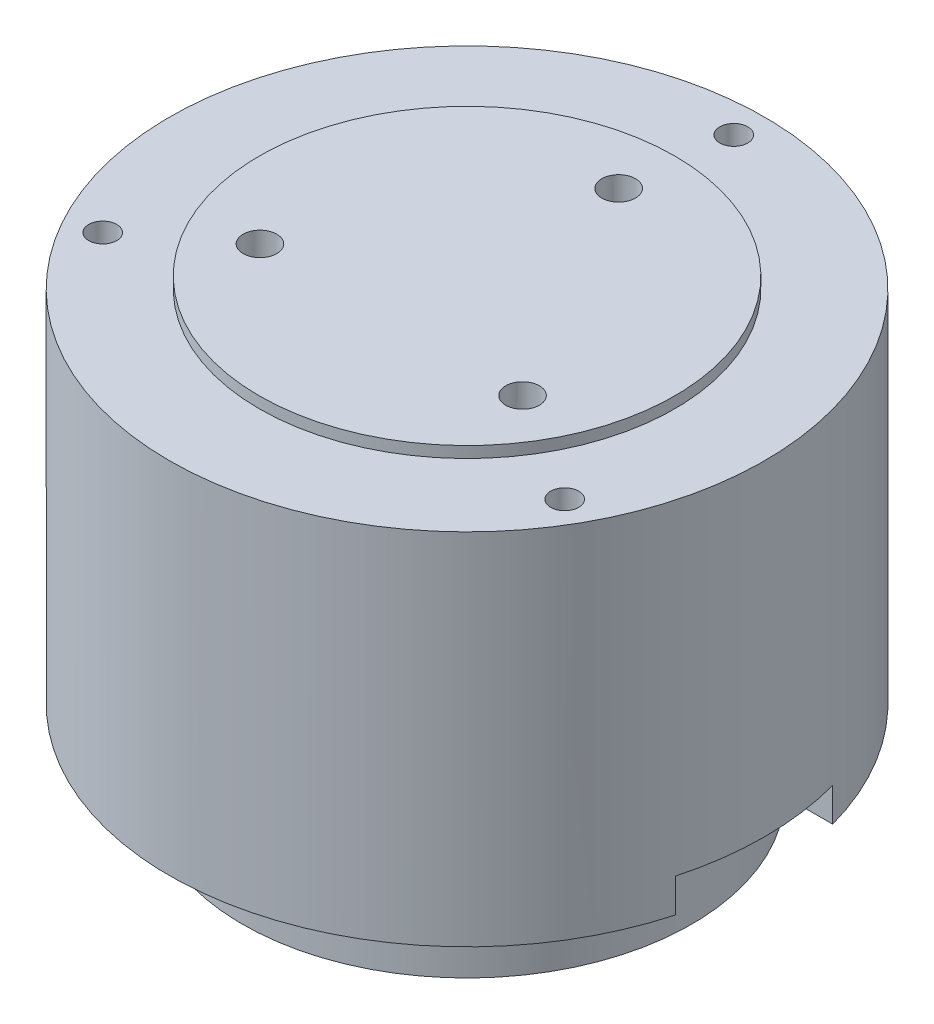
ISO-10303-21;
HEADER;
FILE_DESCRIPTION(('STEP AP214'),'2;1');
FILE_NAME('part.step','',(''),(''),'','','');
FILE_SCHEMA(('AUTOMOTIVE_DESIGN { 1 0 10303 214 1 1 1 1 }'));
ENDSEC;
DATA;
#1=APPLICATION_CONTEXT('core data for automotive mechanical design processes');
#2=APPLICATION_PROTOCOL_DEFINITION('international standard','automotive_design',2000,#1);
#3=PRODUCT_CONTEXT('',#1,'mechanical');
#4=PRODUCT('Part','Part','',(#3));
#5=PRODUCT_RELATED_PRODUCT_CATEGORY('part','',(#4));
#6=PRODUCT_DEFINITION_FORMATION('','',#4);
#7=PRODUCT_DEFINITION_CONTEXT('part definition',#1,'design');
#8=PRODUCT_DEFINITION('design','',#6,#7);
#9=PRODUCT_DEFINITION_SHAPE('','',#8);
#10=(LENGTH_UNIT() NAMED_UNIT(*) SI_UNIT(.MILLI.,.METRE.));
#11=(NAMED_UNIT(*) PLANE_ANGLE_UNIT() SI_UNIT($,.RADIAN.));
#12=(NAMED_UNIT(*) SI_UNIT($,.STERADIAN.) SOLID_ANGLE_UNIT());
#13=UNCERTAINTY_MEASURE_WITH_UNIT(LENGTH_MEASURE(1.E-05),#10,'distance_accuracy_value','');
#14=(GEOMETRIC_REPRESENTATION_CONTEXT(3) GLOBAL_UNCERTAINTY_ASSIGNED_CONTEXT((#13)) GLOBAL_UNIT_ASSIGNED_CONTEXT((#10,
#11,#12)) REPRESENTATION_CONTEXT('',''));
#15=CARTESIAN_POINT('',(0.,0.,0.));
#16=DIRECTION('',(0.,0.,1.));
#17=DIRECTION('',(1.,0.,0.));
#18=AXIS2_PLACEMENT_3D('',#15,#16,#17);
#19=CARTESIAN_POINT('',(0.,0.,0.));
#20=DIRECTION('',(0.,1.,0.));
#21=DIRECTION('',(0.,0.,1.));
#22=AXIS2_PLACEMENT_3D('',#19,#20,#21);
#23=PLANE('',#22);
#24=CARTESIAN_POINT('',(20.5681033398804,0.,11.875));
#25=DIRECTION('',(0.,-1.,0.));
#26=DIRECTION('',(0.,0.,-1.));
#27=AXIS2_PLACEMENT_3D('',#24,#25,#26);
#28=CIRCLE('',#27,1.25);
#29=CARTESIAN_POINT('',(20.5681033398804,0.,10.625));
#30=VERTEX_POINT('',#29);
#31=EDGE_CURVE('E160',#30,#30,#28,.T.);
#32=ORIENTED_EDGE('',*,*,#31,.F.);
#33=EDGE_LOOP('',(#32));
#34=FACE_BOUND('',#33,.T.);
#35=CARTESIAN_POINT('',(-20.5681033398803,0.,11.8750000000002));
#36=DIRECTION('',(0.,-1.,0.));
#37=DIRECTION('',(0.,0.,-1.));
#38=AXIS2_PLACEMENT_3D('',#35,#36,#37);
#39=CIRCLE('',#38,1.25);
#40=CARTESIAN_POINT('',(-20.5681033398803,0.,10.6250000000002));
#41=VERTEX_POINT('',#40);
#42=EDGE_CURVE('E142',#41,#41,#39,.T.);
#43=ORIENTED_EDGE('',*,*,#42,.F.);
#44=EDGE_LOOP('',(#43));
#45=FACE_BOUND('',#44,.T.);
#46=CARTESIAN_POINT('',(0.,0.,23.75));
#47=DIRECTION('',(0.,-1.,0.));
#48=DIRECTION('',(0.,0.,-1.));
#49=AXIS2_PLACEMENT_3D('',#46,#47,#48);
#50=CIRCLE('',#49,1.25);
#51=CARTESIAN_POINT('',(0.,0.,22.5));
#52=VERTEX_POINT('',#51);
#53=EDGE_CURVE('E163',#52,#52,#50,.T.);
#54=ORIENTED_EDGE('',*,*,#53,.F.);
#55=EDGE_LOOP('',(#54));
#56=FACE_BOUND('',#55,.T.);
#57=CARTESIAN_POINT('',(0.,0.,0.));
#58=DIRECTION('',(0.,1.,0.));
#59=DIRECTION('',(0.,0.,1.));
#60=AXIS2_PLACEMENT_3D('',#57,#58,#59);
#61=CIRCLE('',#60,26.5);
#62=CARTESIAN_POINT('',(-25.5587558382641,0.,7.));
#63=VERTEX_POINT('',#62);
#64=CARTESIAN_POINT('',(25.5587558382641,0.,7.));
#65=VERTEX_POINT('',#64);
#66=EDGE_CURVE('E120',#63,#65,#61,.T.);
#67=ORIENTED_EDGE('',*,*,#66,.F.);
#68=DIRECTION('',(-1.,0.,0.));
#69=VECTOR('',#68,1.);
#70=CARTESIAN_POINT('',(-28.911013959568,0.,7.));
#71=LINE('',#70,#69);
#72=CARTESIAN_POINT('',(-18.7349939951952,0.,7.));
#73=VERTEX_POINT('',#72);
#74=EDGE_CURVE('E111',#73,#63,#71,.T.);
#75=ORIENTED_EDGE('',*,*,#74,.F.);
#76=CARTESIAN_POINT('',(0.,0.,0.));
#77=DIRECTION('',(0.,-1.,0.));
#78=DIRECTION('',(0.,0.,-1.));
#79=AXIS2_PLACEMENT_3D('',#76,#77,#78);
#80=CIRCLE('',#79,20.);
#81=CARTESIAN_POINT('',(18.7349939951952,0.,7.));
#82=VERTEX_POINT('',#81);
#83=EDGE_CURVE('E129',#82,#73,#80,.T.);
#84=ORIENTED_EDGE('',*,*,#83,.F.);
#85=EDGE_CURVE('E62',#65,#82,#71,.T.);
#86=ORIENTED_EDGE('',*,*,#85,.F.);
#87=EDGE_LOOP('',(#67,#75,#84,#86));
#88=FACE_BOUND('',#87,.T.);
#89=ADVANCED_FACE('F39',(#34,#45,#56,#88),#23,.F.);
#90=CARTESIAN_POINT('',(0.,32.,0.));
#91=DIRECTION('',(0.,-1.,0.));
#92=DIRECTION('',(0.,0.,-1.));
#93=AXIS2_PLACEMENT_3D('',#90,#91,#92);
#94=CYLINDRICAL_SURFACE('',#93,26.5);
#95=ORIENTED_EDGE('',*,*,#66,.T.);
#96=DIRECTION('',(0.,-1.,0.));
#97=VECTOR('',#96,1.);
#98=CARTESIAN_POINT('',(25.5587558382641,32.,7.));
#99=LINE('',#98,#97);
#100=CARTESIAN_POINT('',(25.5587558382641,3.,7.));
#101=VERTEX_POINT('',#100);
#102=EDGE_CURVE('E212',#65,#101,#99,.F.);
#103=ORIENTED_EDGE('',*,*,#102,.T.);
#104=CARTESIAN_POINT('',(0.,3.,0.));
#105=DIRECTION('',(0.,-1.,0.));
#106=DIRECTION('',(0.,0.,-1.));
#107=AXIS2_PLACEMENT_3D('',#104,#105,#106);
#108=CIRCLE('',#107,26.5);
#109=CARTESIAN_POINT('',(25.5587558382641,3.,-7.));
#110=VERTEX_POINT('',#109);
#111=EDGE_CURVE('E11',#110,#101,#108,.T.);
#112=ORIENTED_EDGE('',*,*,#111,.F.);
#113=DIRECTION('',(0.,-1.,0.));
#114=VECTOR('',#113,1.);
#115=CARTESIAN_POINT('',(25.5587558382641,32.,-7.));
#116=LINE('',#115,#114);
#117=CARTESIAN_POINT('',(25.5587558382641,0.,-7.));
#118=VERTEX_POINT('',#117);
#119=EDGE_CURVE('E99',#110,#118,#116,.T.);
#120=ORIENTED_EDGE('',*,*,#119,.T.);
#121=CARTESIAN_POINT('',(-25.5587558382641,0.,-7.));
#122=VERTEX_POINT('',#121);
#123=EDGE_CURVE('E107',#118,#122,#61,.T.);
#124=ORIENTED_EDGE('',*,*,#123,.T.);
#125=DIRECTION('',(0.,-1.,0.));
#126=VECTOR('',#125,1.);
#127=CARTESIAN_POINT('',(-25.5587558382641,32.,-7.));
#128=LINE('',#127,#126);
#129=CARTESIAN_POINT('',(-25.5587558382641,3.,-7.));
#130=VERTEX_POINT('',#129);
#131=EDGE_CURVE('E92',#122,#130,#128,.F.);
#132=ORIENTED_EDGE('',*,*,#131,.T.);
#133=CARTESIAN_POINT('',(-25.5587558382641,3.,7.));
#134=VERTEX_POINT('',#133);
#135=EDGE_CURVE('E43',#134,#130,#108,.T.);
#136=ORIENTED_EDGE('',*,*,#135,.F.);
#137=DIRECTION('',(0.,-1.,0.));
#138=VECTOR('',#137,1.);
#139=CARTESIAN_POINT('',(-25.5587558382641,32.,7.));
#140=LINE('',#139,#138);
#141=EDGE_CURVE('E196',#134,#63,#140,.T.);
#142=ORIENTED_EDGE('',*,*,#141,.T.);
#143=EDGE_LOOP('',(#95,#103,#112,#120,#124,#132,#136,#142));
#144=FACE_BOUND('',#143,.T.);
#145=CARTESIAN_POINT('',(0.,32.,0.));
#146=DIRECTION('',(0.,1.,0.));
#147=DIRECTION('',(0.,0.,1.));
#148=AXIS2_PLACEMENT_3D('',#145,#146,#147);
#149=CIRCLE('',#148,26.5);
#150=CARTESIAN_POINT('',(0.,32.,26.5));
#151=VERTEX_POINT('',#150);
#152=EDGE_CURVE('E119',#151,#151,#149,.T.);
#153=ORIENTED_EDGE('',*,*,#152,.F.);
#154=EDGE_LOOP('',(#153));
#155=FACE_BOUND('',#154,.T.);
#156=ADVANCED_FACE('F41',(#144,#155),#94,.T.);
#157=CARTESIAN_POINT('',(0.,32.,0.));
#158=DIRECTION('',(0.,1.,0.));
#159=DIRECTION('',(0.,0.,1.));
#160=AXIS2_PLACEMENT_3D('',#157,#158,#159);
#161=PLANE('',#160);
#162=CARTESIAN_POINT('',(0.,32.,-23.75));
#163=DIRECTION('',(0.,1.,0.));
#164=DIRECTION('',(0.,0.,1.));
#165=AXIS2_PLACEMENT_3D('',#162,#163,#164);
#166=CIRCLE('',#165,1.25);
#167=CARTESIAN_POINT('',(0.,32.,-22.5));
#168=VERTEX_POINT('',#167);
#169=EDGE_CURVE('E205',#168,#168,#166,.T.);
#170=ORIENTED_EDGE('',*,*,#169,.F.);
#171=EDGE_LOOP('',(#170));
#172=FACE_BOUND('',#171,.T.);
#173=CARTESIAN_POINT('',(20.5681033398804,32.,11.8750000000001));
#174=DIRECTION('',(0.,1.,0.));
#175=DIRECTION('',(0.,0.,1.));
#176=AXIS2_PLACEMENT_3D('',#173,#174,#175);
#177=CIRCLE('',#176,1.25);
#178=CARTESIAN_POINT('',(20.5681033398804,32.,13.1250000000001));
#179=VERTEX_POINT('',#178);
#180=EDGE_CURVE('E202',#179,#179,#177,.T.);
#181=ORIENTED_EDGE('',*,*,#180,.F.);
#182=EDGE_LOOP('',(#181));
#183=FACE_BOUND('',#182,.T.);
#184=CARTESIAN_POINT('',(-20.5681033398805,32.,11.8749999999998));
#185=DIRECTION('',(0.,1.,0.));
#186=DIRECTION('',(0.,0.,1.));
#187=AXIS2_PLACEMENT_3D('',#184,#185,#186);
#188=CIRCLE('',#187,1.25);
#189=CARTESIAN_POINT('',(-20.5681033398805,32.,13.1249999999998));
#190=VERTEX_POINT('',#189);
#191=EDGE_CURVE('E195',#190,#190,#188,.T.);
#192=ORIENTED_EDGE('',*,*,#191,.F.);
#193=EDGE_LOOP('',(#192));
#194=FACE_BOUND('',#193,.T.);
#195=CARTESIAN_POINT('',(0.,32.,0.));
#196=DIRECTION('',(0.,1.,0.));
#197=DIRECTION('',(0.,0.,1.));
#198=AXIS2_PLACEMENT_3D('',#195,#196,#197);
#199=CIRCLE('',#198,18.5);
#200=CARTESIAN_POINT('',(0.,32.,18.5));
#201=VERTEX_POINT('',#200);
#202=EDGE_CURVE('E128',#201,#201,#199,.T.);
#203=ORIENTED_EDGE('',*,*,#202,.F.);
#204=EDGE_LOOP('',(#203));
#205=FACE_BOUND('',#204,.T.);
#206=ORIENTED_EDGE('',*,*,#152,.T.);
#207=EDGE_LOOP('',(#206));
#208=FACE_BOUND('',#207,.T.);
#209=ADVANCED_FACE('F247',(#172,#183,#194,#205,#208),#161,.T.);
#210=CARTESIAN_POINT('',(-20.5681033398805,0.,-11.8749999999998));
#211=DIRECTION('',(0.,-1.,0.));
#212=DIRECTION('',(0.,0.,-1.));
#213=AXIS2_PLACEMENT_3D('',#210,#211,#212);
#214=CIRCLE('',#213,1.25);
#215=CARTESIAN_POINT('',(-20.5681033398805,0.,-13.1249999999998));
#216=VERTEX_POINT('',#215);
#217=EDGE_CURVE('E141',#216,#216,#214,.T.);
#218=ORIENTED_EDGE('',*,*,#217,.F.);
#219=EDGE_LOOP('',(#218));
#220=FACE_BOUND('',#219,.T.);
#221=CARTESIAN_POINT('',(-1.65845363595049E-13,0.,-23.75));
#222=DIRECTION('',(0.,-1.,0.));
#223=DIRECTION('',(0.,0.,-1.));
#224=AXIS2_PLACEMENT_3D('',#221,#222,#223);
#225=CIRCLE('',#224,1.25);
#226=CARTESIAN_POINT('',(-1.65845363595049E-13,0.,-25.));
#227=VERTEX_POINT('',#226);
#228=EDGE_CURVE('E148',#227,#227,#225,.T.);
#229=ORIENTED_EDGE('',*,*,#228,.F.);
#230=EDGE_LOOP('',(#229));
#231=FACE_BOUND('',#230,.T.);
#232=CARTESIAN_POINT('',(20.5681033398804,0.,-11.8750000000001));
#233=DIRECTION('',(0.,-1.,0.));
#234=DIRECTION('',(0.,0.,-1.));
#235=AXIS2_PLACEMENT_3D('',#232,#233,#234);
#236=CIRCLE('',#235,1.25);
#237=CARTESIAN_POINT('',(20.5681033398804,0.,-13.1250000000001));
#238=VERTEX_POINT('',#237);
#239=EDGE_CURVE('E154',#238,#238,#236,.T.);
#240=ORIENTED_EDGE('',*,*,#239,.F.);
#241=EDGE_LOOP('',(#240));
#242=FACE_BOUND('',#241,.T.);
#243=ORIENTED_EDGE('',*,*,#123,.F.);
#244=DIRECTION('',(1.,0.,0.));
#245=VECTOR('',#244,1.);
#246=CARTESIAN_POINT('',(-28.911013959568,0.,-7.));
#247=LINE('',#246,#245);
#248=CARTESIAN_POINT('',(18.7349939951952,0.,-7.));
#249=VERTEX_POINT('',#248);
#250=EDGE_CURVE('E114',#249,#118,#247,.T.);
#251=ORIENTED_EDGE('',*,*,#250,.F.);
#252=CARTESIAN_POINT('',(-18.7349939951952,0.,-7.));
#253=VERTEX_POINT('',#252);
#254=EDGE_CURVE('E109',#253,#249,#80,.T.);
#255=ORIENTED_EDGE('',*,*,#254,.F.);
#256=EDGE_CURVE('E54',#122,#253,#247,.T.);
#257=ORIENTED_EDGE('',*,*,#256,.F.);
#258=EDGE_LOOP('',(#243,#251,#255,#257));
#259=FACE_BOUND('',#258,.T.);
#260=ADVANCED_FACE('F105',(#220,#231,#242,#259),#23,.F.);
#261=CARTESIAN_POINT('',(0.,-7.,0.));
#262=DIRECTION('',(0.,1.,0.));
#263=DIRECTION('',(0.,0.,1.));
#264=AXIS2_PLACEMENT_3D('',#261,#262,#263);
#265=CYLINDRICAL_SURFACE('',#264,20.);
#266=CARTESIAN_POINT('',(0.,-7.,0.));
#267=DIRECTION('',(0.,-1.,0.));
#268=DIRECTION('',(0.,0.,-1.));
#269=AXIS2_PLACEMENT_3D('',#266,#267,#268);
#270=CIRCLE('',#269,20.);
#271=CARTESIAN_POINT('',(0.,-7.,-20.));
#272=VERTEX_POINT('',#271);
#273=EDGE_CURVE('E123',#272,#272,#270,.T.);
#274=ORIENTED_EDGE('',*,*,#273,.F.);
#275=EDGE_LOOP('',(#274));
#276=FACE_BOUND('',#275,.T.);
#277=EDGE_CURVE('E125',#249,#82,#80,.T.);
#278=ORIENTED_EDGE('',*,*,#277,.T.);
#279=ORIENTED_EDGE('',*,*,#83,.T.);
#280=EDGE_CURVE('E231',#73,#253,#80,.T.);
#281=ORIENTED_EDGE('',*,*,#280,.T.);
#282=ORIENTED_EDGE('',*,*,#254,.T.);
#283=EDGE_LOOP('',(#278,#279,#281,#282));
#284=FACE_BOUND('',#283,.T.);
#285=ADVANCED_FACE('F230',(#276,#284),#265,.T.);
#286=CARTESIAN_POINT('',(0.,-7.,0.));
#287=DIRECTION('',(0.,-1.,0.));
#288=DIRECTION('',(0.,0.,-1.));
#289=AXIS2_PLACEMENT_3D('',#286,#287,#288);
#290=PLANE('',#289);
#291=ORIENTED_EDGE('',*,*,#273,.T.);
#292=EDGE_LOOP('',(#291));
#293=FACE_BOUND('',#292,.T.);
#294=ADVANCED_FACE('F256',(#293),#290,.T.);
#295=CARTESIAN_POINT('',(0.,33.,0.));
#296=DIRECTION('',(0.,-1.,0.));
#297=DIRECTION('',(0.,0.,-1.));
#298=AXIS2_PLACEMENT_3D('',#295,#296,#297);
#299=CYLINDRICAL_SURFACE('',#298,18.5);
#300=CARTESIAN_POINT('',(0.,33.,0.));
#301=DIRECTION('',(0.,1.,0.));
#302=DIRECTION('',(0.,0.,1.));
#303=AXIS2_PLACEMENT_3D('',#300,#301,#302);
#304=CIRCLE('',#303,18.5);
#305=CARTESIAN_POINT('',(0.,33.,18.5));
#306=VERTEX_POINT('',#305);
#307=EDGE_CURVE('E132',#306,#306,#304,.T.);
#308=ORIENTED_EDGE('',*,*,#307,.F.);
#309=EDGE_LOOP('',(#308));
#310=FACE_BOUND('',#309,.T.);
#311=ORIENTED_EDGE('',*,*,#202,.T.);
#312=EDGE_LOOP('',(#311));
#313=FACE_BOUND('',#312,.T.);
#314=ADVANCED_FACE('F305',(#310,#313),#299,.T.);
#315=CARTESIAN_POINT('',(0.,33.,0.));
#316=DIRECTION('',(0.,1.,0.));
#317=DIRECTION('',(0.,0.,1.));
#318=AXIS2_PLACEMENT_3D('',#315,#316,#317);
#319=PLANE('',#318);
#320=CARTESIAN_POINT('',(0.,33.,-13.5));
#321=DIRECTION('',(0.,1.,0.));
#322=DIRECTION('',(0.,0.,1.));
#323=AXIS2_PLACEMENT_3D('',#320,#321,#322);
#324=CIRCLE('',#323,1.5);
#325=CARTESIAN_POINT('',(0.,33.,-12.));
#326=VERTEX_POINT('',#325);
#327=EDGE_CURVE('E187',#326,#326,#324,.T.);
#328=ORIENTED_EDGE('',*,*,#327,.F.);
#329=EDGE_LOOP('',(#328));
#330=FACE_BOUND('',#329,.T.);
#331=CARTESIAN_POINT('',(11.6913429510899,33.,6.75000000000005));
#332=DIRECTION('',(0.,1.,0.));
#333=DIRECTION('',(0.,0.,1.));
#334=AXIS2_PLACEMENT_3D('',#331,#332,#333);
#335=CIRCLE('',#334,1.5);
#336=CARTESIAN_POINT('',(11.6913429510899,33.,8.25000000000006));
#337=VERTEX_POINT('',#336);
#338=EDGE_CURVE('E184',#337,#337,#335,.T.);
#339=ORIENTED_EDGE('',*,*,#338,.F.);
#340=EDGE_LOOP('',(#339));
#341=FACE_BOUND('',#340,.T.);
#342=CARTESIAN_POINT('',(-11.69134295109,33.,6.74999999999989));
#343=DIRECTION('',(0.,1.,0.));
#344=DIRECTION('',(0.,0.,1.));
#345=AXIS2_PLACEMENT_3D('',#342,#343,#344);
#346=CIRCLE('',#345,1.5);
#347=CARTESIAN_POINT('',(-11.69134295109,33.,8.24999999999989));
#348=VERTEX_POINT('',#347);
#349=EDGE_CURVE('E177',#348,#348,#346,.T.);
#350=ORIENTED_EDGE('',*,*,#349,.F.);
#351=EDGE_LOOP('',(#350));
#352=FACE_BOUND('',#351,.T.);
#353=ORIENTED_EDGE('',*,*,#307,.T.);
#354=EDGE_LOOP('',(#353));
#355=FACE_BOUND('',#354,.T.);
#356=ADVANCED_FACE('F302',(#330,#341,#352,#355),#319,.T.);
#357=CARTESIAN_POINT('',(20.5681033398804,3.,11.875));
#358=DIRECTION('',(0.,-1.,0.));
#359=DIRECTION('',(0.,0.,-1.));
#360=AXIS2_PLACEMENT_3D('',#357,#358,#359);
#361=CYLINDRICAL_SURFACE('',#360,1.25);
#362=CARTESIAN_POINT('',(20.5681033398804,3.,11.875));
#363=DIRECTION('',(0.,-1.,0.));
#364=DIRECTION('',(0.,0.,-1.));
#365=AXIS2_PLACEMENT_3D('',#362,#363,#364);
#366=CIRCLE('',#365,1.25);
#367=CARTESIAN_POINT('',(20.5681033398804,3.,10.625));
#368=VERTEX_POINT('',#367);
#369=EDGE_CURVE('E157',#368,#368,#366,.T.);
#370=ORIENTED_EDGE('',*,*,#369,.F.);
#371=EDGE_LOOP('',(#370));
#372=FACE_BOUND('',#371,.T.);
#373=ORIENTED_EDGE('',*,*,#31,.T.);
#374=EDGE_LOOP('',(#373));
#375=FACE_BOUND('',#374,.T.);
#376=ADVANCED_FACE('F280',(#372,#375),#361,.F.);
#377=CARTESIAN_POINT('',(20.5681033398804,3.,11.875));
#378=DIRECTION('',(0.,-1.,0.));
#379=DIRECTION('',(0.,0.,-1.));
#380=AXIS2_PLACEMENT_3D('',#377,#378,#379);
#381=PLANE('',#380);
#382=ORIENTED_EDGE('',*,*,#369,.T.);
#383=EDGE_LOOP('',(#382));
#384=FACE_BOUND('',#383,.T.);
#385=ADVANCED_FACE('F270',(#384),#381,.T.);
#386=CARTESIAN_POINT('',(20.5681033398804,3.,-11.8750000000001));
#387=DIRECTION('',(0.,-1.,0.));
#388=DIRECTION('',(0.,0.,-1.));
#389=AXIS2_PLACEMENT_3D('',#386,#387,#388);
#390=CYLINDRICAL_SURFACE('',#389,1.25);
#391=CARTESIAN_POINT('',(20.5681033398804,3.,-11.8750000000001));
#392=DIRECTION('',(0.,-1.,0.));
#393=DIRECTION('',(0.,0.,-1.));
#394=AXIS2_PLACEMENT_3D('',#391,#392,#393);
#395=CIRCLE('',#394,1.25);
#396=CARTESIAN_POINT('',(20.5681033398804,3.,-13.1250000000001));
#397=VERTEX_POINT('',#396);
#398=EDGE_CURVE('E151',#397,#397,#395,.T.);
#399=ORIENTED_EDGE('',*,*,#398,.F.);
#400=EDGE_LOOP('',(#399));
#401=FACE_BOUND('',#400,.T.);
#402=ORIENTED_EDGE('',*,*,#239,.T.);
#403=EDGE_LOOP('',(#402));
#404=FACE_BOUND('',#403,.T.);
#405=ADVANCED_FACE('F267',(#401,#404),#390,.F.);
#406=CARTESIAN_POINT('',(20.5681033398804,3.,-11.8750000000001));
#407=DIRECTION('',(0.,-1.,0.));
#408=DIRECTION('',(0.,0.,-1.));
#409=AXIS2_PLACEMENT_3D('',#406,#407,#408);
#410=PLANE('',#409);
#411=ORIENTED_EDGE('',*,*,#398,.T.);
#412=EDGE_LOOP('',(#411));
#413=FACE_BOUND('',#412,.T.);
#414=ADVANCED_FACE('F269',(#413),#410,.T.);
#415=CARTESIAN_POINT('',(-1.65845363595049E-13,3.,-23.75));
#416=DIRECTION('',(0.,-1.,0.));
#417=DIRECTION('',(0.,0.,-1.));
#418=AXIS2_PLACEMENT_3D('',#415,#416,#417);
#419=CYLINDRICAL_SURFACE('',#418,1.25);
#420=CARTESIAN_POINT('',(-1.65845363595049E-13,3.,-23.75));
#421=DIRECTION('',(0.,-1.,0.));
#422=DIRECTION('',(0.,0.,-1.));
#423=AXIS2_PLACEMENT_3D('',#420,#421,#422);
#424=CIRCLE('',#423,1.25);
#425=CARTESIAN_POINT('',(-1.65845363595049E-13,3.,-25.));
#426=VERTEX_POINT('',#425);
#427=EDGE_CURVE('E145',#426,#426,#424,.T.);
#428=ORIENTED_EDGE('',*,*,#427,.F.);
#429=EDGE_LOOP('',(#428));
#430=FACE_BOUND('',#429,.T.);
#431=ORIENTED_EDGE('',*,*,#228,.T.);
#432=EDGE_LOOP('',(#431));
#433=FACE_BOUND('',#432,.T.);
#434=ADVANCED_FACE('F277',(#430,#433),#419,.F.);
#435=CARTESIAN_POINT('',(-1.65845363595049E-13,3.,-23.75));
#436=DIRECTION('',(0.,-1.,0.));
#437=DIRECTION('',(0.,0.,-1.));
#438=AXIS2_PLACEMENT_3D('',#435,#436,#437);
#439=PLANE('',#438);
#440=ORIENTED_EDGE('',*,*,#427,.T.);
#441=EDGE_LOOP('',(#440));
#442=FACE_BOUND('',#441,.T.);
#443=ADVANCED_FACE('F288',(#442),#439,.T.);
#444=CARTESIAN_POINT('',(-20.5681033398805,3.,-11.8749999999998));
#445=DIRECTION('',(0.,-1.,0.));
#446=DIRECTION('',(0.,0.,-1.));
#447=AXIS2_PLACEMENT_3D('',#444,#445,#446);
#448=CYLINDRICAL_SURFACE('',#447,1.25);
#449=CARTESIAN_POINT('',(-20.5681033398805,3.,-11.8749999999998));
#450=DIRECTION('',(0.,-1.,0.));
#451=DIRECTION('',(0.,0.,-1.));
#452=AXIS2_PLACEMENT_3D('',#449,#450,#451);
#453=CIRCLE('',#452,1.25);
#454=CARTESIAN_POINT('',(-20.5681033398805,3.,-13.1249999999998));
#455=VERTEX_POINT('',#454);
#456=EDGE_CURVE('E138',#455,#455,#453,.T.);
#457=ORIENTED_EDGE('',*,*,#456,.F.);
#458=EDGE_LOOP('',(#457));
#459=FACE_BOUND('',#458,.T.);
#460=ORIENTED_EDGE('',*,*,#217,.T.);
#461=EDGE_LOOP('',(#460));
#462=FACE_BOUND('',#461,.T.);
#463=ADVANCED_FACE('F292',(#459,#462),#448,.F.);
#464=CARTESIAN_POINT('',(-20.5681033398805,3.,-11.8749999999998));
#465=DIRECTION('',(0.,-1.,0.));
#466=DIRECTION('',(0.,0.,-1.));
#467=AXIS2_PLACEMENT_3D('',#464,#465,#466);
#468=PLANE('',#467);
#469=ORIENTED_EDGE('',*,*,#456,.T.);
#470=EDGE_LOOP('',(#469));
#471=FACE_BOUND('',#470,.T.);
#472=ADVANCED_FACE('F296',(#471),#468,.T.);
#473=CARTESIAN_POINT('',(-20.5681033398803,3.,11.8750000000002));
#474=DIRECTION('',(0.,-1.,0.));
#475=DIRECTION('',(0.,0.,-1.));
#476=AXIS2_PLACEMENT_3D('',#473,#474,#475);
#477=CYLINDRICAL_SURFACE('',#476,1.25);
#478=CARTESIAN_POINT('',(-20.5681033398803,3.,11.8750000000002));
#479=DIRECTION('',(0.,-1.,0.));
#480=DIRECTION('',(0.,0.,-1.));
#481=AXIS2_PLACEMENT_3D('',#478,#479,#480);
#482=CIRCLE('',#481,1.25);
#483=CARTESIAN_POINT('',(-20.5681033398803,3.,10.6250000000002));
#484=VERTEX_POINT('',#483);
#485=EDGE_CURVE('E164',#484,#484,#482,.T.);
#486=ORIENTED_EDGE('',*,*,#485,.F.);
#487=EDGE_LOOP('',(#486));
#488=FACE_BOUND('',#487,.T.);
#489=ORIENTED_EDGE('',*,*,#42,.T.);
#490=EDGE_LOOP('',(#489));
#491=FACE_BOUND('',#490,.T.);
#492=ADVANCED_FACE('F300',(#488,#491),#477,.F.);
#493=CARTESIAN_POINT('',(-20.5681033398803,3.,11.8750000000002));
#494=DIRECTION('',(0.,-1.,0.));
#495=DIRECTION('',(0.,0.,-1.));
#496=AXIS2_PLACEMENT_3D('',#493,#494,#495);
#497=PLANE('',#496);
#498=ORIENTED_EDGE('',*,*,#485,.T.);
#499=EDGE_LOOP('',(#498));
#500=FACE_BOUND('',#499,.T.);
#501=ADVANCED_FACE('F378',(#500),#497,.T.);
#502=CARTESIAN_POINT('',(0.,3.,23.75));
#503=DIRECTION('',(0.,-1.,0.));
#504=DIRECTION('',(0.,0.,-1.));
#505=AXIS2_PLACEMENT_3D('',#502,#503,#504);
#506=CYLINDRICAL_SURFACE('',#505,1.25);
#507=CARTESIAN_POINT('',(0.,3.,23.75));
#508=DIRECTION('',(0.,-1.,0.));
#509=DIRECTION('',(0.,0.,-1.));
#510=AXIS2_PLACEMENT_3D('',#507,#508,#509);
#511=CIRCLE('',#510,1.25);
#512=CARTESIAN_POINT('',(0.,3.,22.5));
#513=VERTEX_POINT('',#512);
#514=EDGE_CURVE('E137',#513,#513,#511,.T.);
#515=ORIENTED_EDGE('',*,*,#514,.F.);
#516=EDGE_LOOP('',(#515));
#517=FACE_BOUND('',#516,.T.);
#518=ORIENTED_EDGE('',*,*,#53,.T.);
#519=EDGE_LOOP('',(#518));
#520=FACE_BOUND('',#519,.T.);
#521=ADVANCED_FACE('F388',(#517,#520),#506,.F.);
#522=CARTESIAN_POINT('',(0.,3.,23.75));
#523=DIRECTION('',(0.,-1.,0.));
#524=DIRECTION('',(0.,0.,-1.));
#525=AXIS2_PLACEMENT_3D('',#522,#523,#524);
#526=PLANE('',#525);
#527=ORIENTED_EDGE('',*,*,#514,.T.);
#528=EDGE_LOOP('',(#527));
#529=FACE_BOUND('',#528,.T.);
#530=ADVANCED_FACE('F398',(#529),#526,.T.);
#531=CARTESIAN_POINT('',(-11.69134295109,29.,6.74999999999989));
#532=DIRECTION('',(0.,1.,0.));
#533=DIRECTION('',(0.,0.,1.));
#534=AXIS2_PLACEMENT_3D('',#531,#532,#533);
#535=CYLINDRICAL_SURFACE('',#534,1.5);
#536=CARTESIAN_POINT('',(-11.69134295109,29.,6.74999999999989));
#537=DIRECTION('',(0.,1.,0.));
#538=DIRECTION('',(0.,0.,1.));
#539=AXIS2_PLACEMENT_3D('',#536,#537,#538);
#540=CIRCLE('',#539,1.5);
#541=CARTESIAN_POINT('',(-11.69134295109,29.,8.24999999999989));
#542=VERTEX_POINT('',#541);
#543=EDGE_CURVE('E174',#542,#542,#540,.T.);
#544=ORIENTED_EDGE('',*,*,#543,.F.);
#545=EDGE_LOOP('',(#544));
#546=FACE_BOUND('',#545,.T.);
#547=ORIENTED_EDGE('',*,*,#349,.T.);
#548=EDGE_LOOP('',(#547));
#549=FACE_BOUND('',#548,.T.);
#550=ADVANCED_FACE('F408',(#546,#549),#535,.F.);
#551=CARTESIAN_POINT('',(-11.69134295109,29.,6.74999999999989));
#552=DIRECTION('',(0.,1.,0.));
#553=DIRECTION('',(0.,0.,1.));
#554=AXIS2_PLACEMENT_3D('',#551,#552,#553);
#555=PLANE('',#554);
#556=ORIENTED_EDGE('',*,*,#543,.T.);
#557=EDGE_LOOP('',(#556));
#558=FACE_BOUND('',#557,.T.);
#559=ADVANCED_FACE('F418',(#558),#555,.T.);
#560=CARTESIAN_POINT('',(11.6913429510899,29.,6.75000000000005));
#561=DIRECTION('',(0.,1.,0.));
#562=DIRECTION('',(0.,0.,1.));
#563=AXIS2_PLACEMENT_3D('',#560,#561,#562);
#564=CYLINDRICAL_SURFACE('',#563,1.5);
#565=CARTESIAN_POINT('',(11.6913429510899,29.,6.75000000000005));
#566=DIRECTION('',(0.,1.,0.));
#567=DIRECTION('',(0.,0.,1.));
#568=AXIS2_PLACEMENT_3D('',#565,#566,#567);
#569=CIRCLE('',#568,1.5);
#570=CARTESIAN_POINT('',(11.6913429510899,29.,8.25000000000006));
#571=VERTEX_POINT('',#570);
#572=EDGE_CURVE('E181',#571,#571,#569,.T.);
#573=ORIENTED_EDGE('',*,*,#572,.F.);
#574=EDGE_LOOP('',(#573));
#575=FACE_BOUND('',#574,.T.);
#576=ORIENTED_EDGE('',*,*,#338,.T.);
#577=EDGE_LOOP('',(#576));
#578=FACE_BOUND('',#577,.T.);
#579=ADVANCED_FACE('F428',(#575,#578),#564,.F.);
#580=CARTESIAN_POINT('',(11.6913429510899,29.,6.75000000000005));
#581=DIRECTION('',(0.,1.,0.));
#582=DIRECTION('',(0.,0.,1.));
#583=AXIS2_PLACEMENT_3D('',#580,#581,#582);
#584=PLANE('',#583);
#585=ORIENTED_EDGE('',*,*,#572,.T.);
#586=EDGE_LOOP('',(#585));
#587=FACE_BOUND('',#586,.T.);
#588=ADVANCED_FACE('F438',(#587),#584,.T.);
#589=CARTESIAN_POINT('',(0.,29.,-13.5));
#590=DIRECTION('',(0.,1.,0.));
#591=DIRECTION('',(0.,0.,1.));
#592=AXIS2_PLACEMENT_3D('',#589,#590,#591);
#593=CYLINDRICAL_SURFACE('',#592,1.5);
#594=CARTESIAN_POINT('',(0.,29.,-13.5));
#595=DIRECTION('',(0.,1.,0.));
#596=DIRECTION('',(0.,0.,1.));
#597=AXIS2_PLACEMENT_3D('',#594,#595,#596);
#598=CIRCLE('',#597,1.5);
#599=CARTESIAN_POINT('',(0.,29.,-12.));
#600=VERTEX_POINT('',#599);
#601=EDGE_CURVE('E167',#600,#600,#598,.T.);
#602=ORIENTED_EDGE('',*,*,#601,.F.);
#603=EDGE_LOOP('',(#602));
#604=FACE_BOUND('',#603,.T.);
#605=ORIENTED_EDGE('',*,*,#327,.T.);
#606=EDGE_LOOP('',(#605));
#607=FACE_BOUND('',#606,.T.);
#608=ADVANCED_FACE('F448',(#604,#607),#593,.F.);
#609=CARTESIAN_POINT('',(0.,29.,-13.5));
#610=DIRECTION('',(0.,1.,0.));
#611=DIRECTION('',(0.,0.,1.));
#612=AXIS2_PLACEMENT_3D('',#609,#610,#611);
#613=PLANE('',#612);
#614=ORIENTED_EDGE('',*,*,#601,.T.);
#615=EDGE_LOOP('',(#614));
#616=FACE_BOUND('',#615,.T.);
#617=ADVANCED_FACE('F458',(#616),#613,.T.);
#618=CARTESIAN_POINT('',(-20.5681033398805,27.,11.8749999999998));
#619=DIRECTION('',(0.,1.,0.));
#620=DIRECTION('',(0.,0.,1.));
#621=AXIS2_PLACEMENT_3D('',#618,#619,#620);
#622=CYLINDRICAL_SURFACE('',#621,1.25);
#623=CARTESIAN_POINT('',(-20.5681033398805,27.,11.8749999999998));
#624=DIRECTION('',(0.,1.,0.));
#625=DIRECTION('',(0.,0.,1.));
#626=AXIS2_PLACEMENT_3D('',#623,#624,#625);
#627=CIRCLE('',#626,1.25);
#628=CARTESIAN_POINT('',(-20.5681033398805,27.,13.1249999999998));
#629=VERTEX_POINT('',#628);
#630=EDGE_CURVE('E192',#629,#629,#627,.T.);
#631=ORIENTED_EDGE('',*,*,#630,.F.);
#632=EDGE_LOOP('',(#631));
#633=FACE_BOUND('',#632,.T.);
#634=ORIENTED_EDGE('',*,*,#191,.T.);
#635=EDGE_LOOP('',(#634));
#636=FACE_BOUND('',#635,.T.);
#637=ADVANCED_FACE('F468',(#633,#636),#622,.F.);
#638=CARTESIAN_POINT('',(-20.5681033398805,27.,11.8749999999998));
#639=DIRECTION('',(0.,1.,0.));
#640=DIRECTION('',(0.,0.,1.));
#641=AXIS2_PLACEMENT_3D('',#638,#639,#640);
#642=PLANE('',#641);
#643=ORIENTED_EDGE('',*,*,#630,.T.);
#644=EDGE_LOOP('',(#643));
#645=FACE_BOUND('',#644,.T.);
#646=ADVANCED_FACE('F478',(#645),#642,.T.);
#647=CARTESIAN_POINT('',(20.5681033398804,27.,11.8750000000001));
#648=DIRECTION('',(0.,1.,0.));
#649=DIRECTION('',(0.,0.,1.));
#650=AXIS2_PLACEMENT_3D('',#647,#648,#649);
#651=CYLINDRICAL_SURFACE('',#650,1.25);
#652=CARTESIAN_POINT('',(20.5681033398804,27.,11.8750000000001));
#653=DIRECTION('',(0.,1.,0.));
#654=DIRECTION('',(0.,0.,1.));
#655=AXIS2_PLACEMENT_3D('',#652,#653,#654);
#656=CIRCLE('',#655,1.25);
#657=CARTESIAN_POINT('',(20.5681033398804,27.,13.1250000000001));
#658=VERTEX_POINT('',#657);
#659=EDGE_CURVE('E199',#658,#658,#656,.T.);
#660=ORIENTED_EDGE('',*,*,#659,.F.);
#661=EDGE_LOOP('',(#660));
#662=FACE_BOUND('',#661,.T.);
#663=ORIENTED_EDGE('',*,*,#180,.T.);
#664=EDGE_LOOP('',(#663));
#665=FACE_BOUND('',#664,.T.);
#666=ADVANCED_FACE('F488',(#662,#665),#651,.F.);
#667=CARTESIAN_POINT('',(20.5681033398804,27.,11.8750000000001));
#668=DIRECTION('',(0.,1.,0.));
#669=DIRECTION('',(0.,0.,1.));
#670=AXIS2_PLACEMENT_3D('',#667,#668,#669);
#671=PLANE('',#670);
#672=ORIENTED_EDGE('',*,*,#659,.T.);
#673=EDGE_LOOP('',(#672));
#674=FACE_BOUND('',#673,.T.);
#675=ADVANCED_FACE('F498',(#674),#671,.T.);
#676=CARTESIAN_POINT('',(0.,27.,-23.75));
#677=DIRECTION('',(0.,1.,0.));
#678=DIRECTION('',(0.,0.,1.));
#679=AXIS2_PLACEMENT_3D('',#676,#677,#678);
#680=CYLINDRICAL_SURFACE('',#679,1.25);
#681=CARTESIAN_POINT('',(0.,27.,-23.75));
#682=DIRECTION('',(0.,1.,0.));
#683=DIRECTION('',(0.,0.,1.));
#684=AXIS2_PLACEMENT_3D('',#681,#682,#683);
#685=CIRCLE('',#684,1.25);
#686=CARTESIAN_POINT('',(0.,27.,-22.5));
#687=VERTEX_POINT('',#686);
#688=EDGE_CURVE('E178',#687,#687,#685,.T.);
#689=ORIENTED_EDGE('',*,*,#688,.F.);
#690=EDGE_LOOP('',(#689));
#691=FACE_BOUND('',#690,.T.);
#692=ORIENTED_EDGE('',*,*,#169,.T.);
#693=EDGE_LOOP('',(#692));
#694=FACE_BOUND('',#693,.T.);
#695=ADVANCED_FACE('F508',(#691,#694),#680,.F.);
#696=CARTESIAN_POINT('',(0.,27.,-23.75));
#697=DIRECTION('',(0.,1.,0.));
#698=DIRECTION('',(0.,0.,1.));
#699=AXIS2_PLACEMENT_3D('',#696,#697,#698);
#700=PLANE('',#699);
#701=ORIENTED_EDGE('',*,*,#688,.T.);
#702=EDGE_LOOP('',(#701));
#703=FACE_BOUND('',#702,.T.);
#704=ADVANCED_FACE('F518',(#703),#700,.T.);
#705=CARTESIAN_POINT('',(0.,3.,0.));
#706=DIRECTION('',(0.,-1.,0.));
#707=DIRECTION('',(0.,0.,-1.));
#708=AXIS2_PLACEMENT_3D('',#705,#706,#707);
#709=PLANE('',#708);
#710=ORIENTED_EDGE('',*,*,#111,.T.);
#711=DIRECTION('',(-1.,0.,0.));
#712=VECTOR('',#711,1.);
#713=CARTESIAN_POINT('',(-28.911013959568,3.,7.));
#714=LINE('',#713,#712);
#715=EDGE_CURVE('E100',#101,#134,#714,.T.);
#716=ORIENTED_EDGE('',*,*,#715,.T.);
#717=ORIENTED_EDGE('',*,*,#135,.T.);
#718=DIRECTION('',(1.,0.,0.));
#719=VECTOR('',#718,1.);
#720=CARTESIAN_POINT('',(-28.911013959568,3.,-7.));
#721=LINE('',#720,#719);
#722=EDGE_CURVE('E95',#130,#110,#721,.T.);
#723=ORIENTED_EDGE('',*,*,#722,.T.);
#724=EDGE_LOOP('',(#710,#716,#717,#723));
#725=FACE_BOUND('',#724,.T.);
#726=ADVANCED_FACE('F527',(#725),#709,.T.);
#727=CARTESIAN_POINT('',(-28.911013959568,3.,7.));
#728=DIRECTION('',(0.,0.,1.));
#729=DIRECTION('',(1.,0.,0.));
#730=AXIS2_PLACEMENT_3D('',#727,#728,#729);
#731=PLANE('',#730);
#732=ORIENTED_EDGE('',*,*,#715,.F.);
#733=ORIENTED_EDGE('',*,*,#102,.F.);
#734=ORIENTED_EDGE('',*,*,#85,.T.);
#735=EDGE_CURVE('E216',#82,#73,#71,.T.);
#736=ORIENTED_EDGE('',*,*,#735,.T.);
#737=ORIENTED_EDGE('',*,*,#74,.T.);
#738=ORIENTED_EDGE('',*,*,#141,.F.);
#739=EDGE_LOOP('',(#732,#733,#734,#736,#737,#738));
#740=FACE_BOUND('',#739,.T.);
#741=ADVANCED_FACE('F223',(#740),#731,.F.);
#742=CARTESIAN_POINT('',(-28.911013959568,3.,-7.));
#743=DIRECTION('',(0.,0.,-1.));
#744=DIRECTION('',(-1.,0.,0.));
#745=AXIS2_PLACEMENT_3D('',#742,#743,#744);
#746=PLANE('',#745);
#747=ORIENTED_EDGE('',*,*,#722,.F.);
#748=ORIENTED_EDGE('',*,*,#131,.F.);
#749=ORIENTED_EDGE('',*,*,#256,.T.);
#750=EDGE_CURVE('E112',#253,#249,#247,.T.);
#751=ORIENTED_EDGE('',*,*,#750,.T.);
#752=ORIENTED_EDGE('',*,*,#250,.T.);
#753=ORIENTED_EDGE('',*,*,#119,.F.);
#754=EDGE_LOOP('',(#747,#748,#749,#751,#752,#753));
#755=FACE_BOUND('',#754,.T.);
#756=ADVANCED_FACE('F93',(#755),#746,.F.);
#757=CARTESIAN_POINT('',(0.,0.,0.));
#758=DIRECTION('',(0.,-1.,0.));
#759=DIRECTION('',(0.,0.,-1.));
#760=AXIS2_PLACEMENT_3D('',#757,#758,#759);
#761=PLANE('',#760);
#762=ORIENTED_EDGE('',*,*,#750,.F.);
#763=ORIENTED_EDGE('',*,*,#280,.F.);
#764=ORIENTED_EDGE('',*,*,#735,.F.);
#765=ORIENTED_EDGE('',*,*,#277,.F.);
#766=EDGE_LOOP('',(#762,#763,#764,#765));
#767=FACE_BOUND('',#766,.T.);
#768=ADVANCED_FACE('F232',(#767),#761,.F.);
#769=CLOSED_SHELL('',(#89,#156,#209,#260,#285,#294,#314,#356,#376,#385,#405,#414,#434,#443,#463,
#472,#492,#501,#521,#530,#550,#559,#579,#588,#608,#617,#637,#646,#666,#675,#695,#704,#726,#741,
#756,#768));
#770=MANIFOLD_SOLID_BREP('B2',#769);
#771=ADVANCED_BREP_SHAPE_REPRESENTATION('',(#18,#770),#14);
#772=SHAPE_DEFINITION_REPRESENTATION(#9,#771);
ENDSEC;
END-ISO-10303-21;
